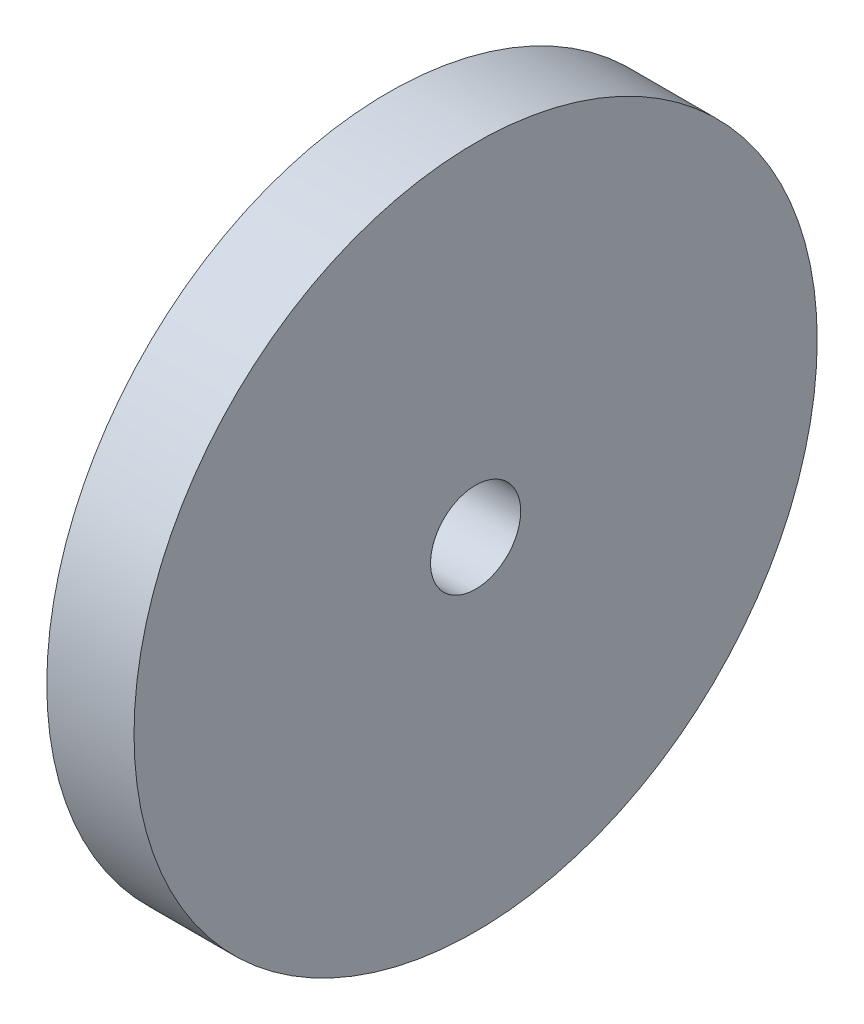
ISO-10303-21;
HEADER;
FILE_DESCRIPTION(('STEP AP214'),'2;1');
FILE_NAME('part.step','',(''),(''),'','','');
FILE_SCHEMA(('AUTOMOTIVE_DESIGN { 1 0 10303 214 1 1 1 1 }'));
ENDSEC;
DATA;
#1=APPLICATION_CONTEXT('core data for automotive mechanical design processes');
#2=APPLICATION_PROTOCOL_DEFINITION('international standard','automotive_design',2000,#1);
#3=PRODUCT_CONTEXT('',#1,'mechanical');
#4=PRODUCT('Part','Part','',(#3));
#5=PRODUCT_RELATED_PRODUCT_CATEGORY('part','',(#4));
#6=PRODUCT_DEFINITION_FORMATION('','',#4);
#7=PRODUCT_DEFINITION_CONTEXT('part definition',#1,'design');
#8=PRODUCT_DEFINITION('design','',#6,#7);
#9=PRODUCT_DEFINITION_SHAPE('','',#8);
#10=(LENGTH_UNIT() NAMED_UNIT(*) SI_UNIT(.MILLI.,.METRE.));
#11=(NAMED_UNIT(*) PLANE_ANGLE_UNIT() SI_UNIT($,.RADIAN.));
#12=(NAMED_UNIT(*) SI_UNIT($,.STERADIAN.) SOLID_ANGLE_UNIT());
#13=UNCERTAINTY_MEASURE_WITH_UNIT(LENGTH_MEASURE(1.E-05),#10,'distance_accuracy_value','');
#14=(GEOMETRIC_REPRESENTATION_CONTEXT(3) GLOBAL_UNCERTAINTY_ASSIGNED_CONTEXT((#13)) GLOBAL_UNIT_ASSIGNED_CONTEXT((#10,
#11,#12)) REPRESENTATION_CONTEXT('',''));
#15=CARTESIAN_POINT('',(0.,0.,0.));
#16=DIRECTION('',(0.,0.,1.));
#17=DIRECTION('',(1.,0.,0.));
#18=AXIS2_PLACEMENT_3D('',#15,#16,#17);
#19=CARTESIAN_POINT('',(3.,0.,0.));
#20=DIRECTION('',(1.,0.,0.));
#21=DIRECTION('',(0.,0.,-1.));
#22=AXIS2_PLACEMENT_3D('',#19,#20,#21);
#23=PLANE('',#22);
#24=CARTESIAN_POINT('',(3.,0.,0.));
#25=DIRECTION('',(1.,0.,0.));
#26=DIRECTION('',(0.,0.,-1.));
#27=AXIS2_PLACEMENT_3D('',#24,#25,#26);
#28=CIRCLE('',#27,11.75);
#29=CARTESIAN_POINT('',(3.,0.,-11.75));
#30=VERTEX_POINT('',#29);
#31=EDGE_CURVE('E10',#30,#30,#28,.T.);
#32=ORIENTED_EDGE('',*,*,#31,.T.);
#33=EDGE_LOOP('',(#32));
#34=FACE_BOUND('',#33,.T.);
#35=CARTESIAN_POINT('',(3.,0.,0.));
#36=DIRECTION('',(1.,0.,0.));
#37=DIRECTION('',(0.,0.,-1.));
#38=AXIS2_PLACEMENT_3D('',#35,#36,#37);
#39=CIRCLE('',#38,1.55);
#40=CARTESIAN_POINT('',(3.,0.,-1.55));
#41=VERTEX_POINT('',#40);
#42=EDGE_CURVE('E42',#41,#41,#39,.T.);
#43=ORIENTED_EDGE('',*,*,#42,.F.);
#44=EDGE_LOOP('',(#43));
#45=FACE_BOUND('',#44,.T.);
#46=ADVANCED_FACE('F31',(#34,#45),#23,.T.);
#47=CARTESIAN_POINT('',(0.,0.,0.));
#48=DIRECTION('',(1.,0.,0.));
#49=DIRECTION('',(0.,0.,-1.));
#50=AXIS2_PLACEMENT_3D('',#47,#48,#49);
#51=PLANE('',#50);
#52=CARTESIAN_POINT('',(0.,0.,0.));
#53=DIRECTION('',(1.,0.,0.));
#54=DIRECTION('',(0.,0.,-1.));
#55=AXIS2_PLACEMENT_3D('',#52,#53,#54);
#56=CIRCLE('',#55,11.75);
#57=CARTESIAN_POINT('',(0.,0.,-11.75));
#58=VERTEX_POINT('',#57);
#59=EDGE_CURVE('E35',#58,#58,#56,.T.);
#60=ORIENTED_EDGE('',*,*,#59,.F.);
#61=EDGE_LOOP('',(#60));
#62=FACE_BOUND('',#61,.T.);
#63=CARTESIAN_POINT('',(0.,0.,0.));
#64=DIRECTION('',(1.,0.,0.));
#65=DIRECTION('',(0.,0.,-1.));
#66=AXIS2_PLACEMENT_3D('',#63,#64,#65);
#67=CIRCLE('',#66,1.55);
#68=CARTESIAN_POINT('',(0.,0.,-1.55));
#69=VERTEX_POINT('',#68);
#70=EDGE_CURVE('E44',#69,#69,#67,.T.);
#71=ORIENTED_EDGE('',*,*,#70,.T.);
#72=EDGE_LOOP('',(#71));
#73=FACE_BOUND('',#72,.T.);
#74=ADVANCED_FACE('F54',(#62,#73),#51,.F.);
#75=CARTESIAN_POINT('',(3.,0.,0.));
#76=DIRECTION('',(-1.,0.,0.));
#77=DIRECTION('',(0.,0.,1.));
#78=AXIS2_PLACEMENT_3D('',#75,#76,#77);
#79=CYLINDRICAL_SURFACE('',#78,11.75);
#80=ORIENTED_EDGE('',*,*,#31,.F.);
#81=EDGE_LOOP('',(#80));
#82=FACE_BOUND('',#81,.T.);
#83=ORIENTED_EDGE('',*,*,#59,.T.);
#84=EDGE_LOOP('',(#83));
#85=FACE_BOUND('',#84,.T.);
#86=ADVANCED_FACE('F33',(#82,#85),#79,.T.);
#87=CARTESIAN_POINT('',(3.,0.,0.));
#88=DIRECTION('',(-1.,0.,0.));
#89=DIRECTION('',(0.,0.,1.));
#90=AXIS2_PLACEMENT_3D('',#87,#88,#89);
#91=CYLINDRICAL_SURFACE('',#90,1.55);
#92=ORIENTED_EDGE('',*,*,#42,.T.);
#93=EDGE_LOOP('',(#92));
#94=FACE_BOUND('',#93,.T.);
#95=ORIENTED_EDGE('',*,*,#70,.F.);
#96=EDGE_LOOP('',(#95));
#97=FACE_BOUND('',#96,.T.);
#98=ADVANCED_FACE('F50',(#94,#97),#91,.F.);
#99=CLOSED_SHELL('',(#46,#74,#86,#98));
#100=MANIFOLD_SOLID_BREP('B2',#99);
#101=ADVANCED_BREP_SHAPE_REPRESENTATION('',(#18,#100),#14);
#102=SHAPE_DEFINITION_REPRESENTATION(#9,#101);
ENDSEC;
END-ISO-10303-21;
